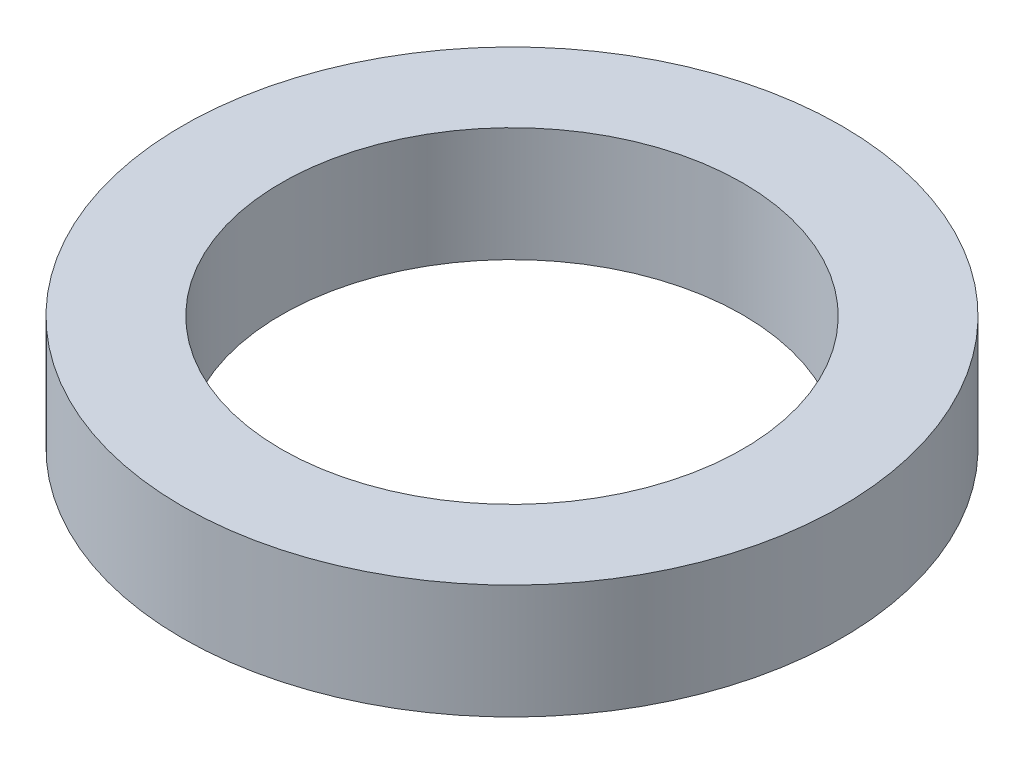
ISO-10303-21;
HEADER;
FILE_DESCRIPTION(('STEP AP214'),'2;1');
FILE_NAME('part.step','',(''),(''),'','','');
FILE_SCHEMA(('AUTOMOTIVE_DESIGN { 1 0 10303 214 1 1 1 1 }'));
ENDSEC;
DATA;
#1=APPLICATION_CONTEXT('core data for automotive mechanical design processes');
#2=APPLICATION_PROTOCOL_DEFINITION('international standard','automotive_design',2000,#1);
#3=PRODUCT_CONTEXT('',#1,'mechanical');
#4=PRODUCT('Part','Part','',(#3));
#5=PRODUCT_RELATED_PRODUCT_CATEGORY('part','',(#4));
#6=PRODUCT_DEFINITION_FORMATION('','',#4);
#7=PRODUCT_DEFINITION_CONTEXT('part definition',#1,'design');
#8=PRODUCT_DEFINITION('design','',#6,#7);
#9=PRODUCT_DEFINITION_SHAPE('','',#8);
#10=(LENGTH_UNIT() NAMED_UNIT(*) SI_UNIT(.MILLI.,.METRE.));
#11=(NAMED_UNIT(*) PLANE_ANGLE_UNIT() SI_UNIT($,.RADIAN.));
#12=(NAMED_UNIT(*) SI_UNIT($,.STERADIAN.) SOLID_ANGLE_UNIT());
#13=UNCERTAINTY_MEASURE_WITH_UNIT(LENGTH_MEASURE(1.E-05),#10,'distance_accuracy_value','');
#14=(GEOMETRIC_REPRESENTATION_CONTEXT(3) GLOBAL_UNCERTAINTY_ASSIGNED_CONTEXT((#13)) GLOBAL_UNIT_ASSIGNED_CONTEXT((#10,
#11,#12)) REPRESENTATION_CONTEXT('',''));
#15=CARTESIAN_POINT('',(0.,0.,0.));
#16=DIRECTION('',(0.,0.,1.));
#17=DIRECTION('',(1.,0.,0.));
#18=AXIS2_PLACEMENT_3D('',#15,#16,#17);
#19=CARTESIAN_POINT('',(0.,1.3208,0.));
#20=DIRECTION('',(0.,1.,0.));
#21=DIRECTION('',(0.,0.,1.));
#22=AXIS2_PLACEMENT_3D('',#19,#20,#21);
#23=PLANE('',#22);
#24=CARTESIAN_POINT('',(0.,1.3208,0.));
#25=DIRECTION('',(0.,1.,0.));
#26=DIRECTION('',(0.,0.,1.));
#27=AXIS2_PLACEMENT_3D('',#24,#25,#26);
#28=CIRCLE('',#27,3.81);
#29=CARTESIAN_POINT('',(0.,1.3208,3.81));
#30=VERTEX_POINT('',#29);
#31=EDGE_CURVE('E10',#30,#30,#28,.T.);
#32=ORIENTED_EDGE('',*,*,#31,.T.);
#33=EDGE_LOOP('',(#32));
#34=FACE_BOUND('',#33,.T.);
#35=CARTESIAN_POINT('',(0.,1.3208,0.));
#36=DIRECTION('',(0.,1.,0.));
#37=DIRECTION('',(0.,0.,1.));
#38=AXIS2_PLACEMENT_3D('',#35,#36,#37);
#39=CIRCLE('',#38,2.667);
#40=CARTESIAN_POINT('',(0.,1.3208,2.667));
#41=VERTEX_POINT('',#40);
#42=EDGE_CURVE('E43',#41,#41,#39,.T.);
#43=ORIENTED_EDGE('',*,*,#42,.F.);
#44=EDGE_LOOP('',(#43));
#45=FACE_BOUND('',#44,.T.);
#46=ADVANCED_FACE('F32',(#34,#45),#23,.T.);
#47=CARTESIAN_POINT('',(0.,0.,0.));
#48=DIRECTION('',(0.,1.,0.));
#49=DIRECTION('',(0.,0.,1.));
#50=AXIS2_PLACEMENT_3D('',#47,#48,#49);
#51=PLANE('',#50);
#52=CARTESIAN_POINT('',(0.,0.,0.));
#53=DIRECTION('',(0.,1.,0.));
#54=DIRECTION('',(0.,0.,1.));
#55=AXIS2_PLACEMENT_3D('',#52,#53,#54);
#56=CIRCLE('',#55,3.81);
#57=CARTESIAN_POINT('',(0.,0.,3.81));
#58=VERTEX_POINT('',#57);
#59=EDGE_CURVE('E36',#58,#58,#56,.T.);
#60=ORIENTED_EDGE('',*,*,#59,.F.);
#61=EDGE_LOOP('',(#60));
#62=FACE_BOUND('',#61,.T.);
#63=CARTESIAN_POINT('',(0.,0.,0.));
#64=DIRECTION('',(0.,1.,0.));
#65=DIRECTION('',(0.,0.,1.));
#66=AXIS2_PLACEMENT_3D('',#63,#64,#65);
#67=CIRCLE('',#66,2.667);
#68=CARTESIAN_POINT('',(0.,0.,2.667));
#69=VERTEX_POINT('',#68);
#70=EDGE_CURVE('E45',#69,#69,#67,.T.);
#71=ORIENTED_EDGE('',*,*,#70,.T.);
#72=EDGE_LOOP('',(#71));
#73=FACE_BOUND('',#72,.T.);
#74=ADVANCED_FACE('F55',(#62,#73),#51,.F.);
#75=CARTESIAN_POINT('',(0.,1.3208,0.));
#76=DIRECTION('',(0.,-1.,0.));
#77=DIRECTION('',(0.,0.,-1.));
#78=AXIS2_PLACEMENT_3D('',#75,#76,#77);
#79=CYLINDRICAL_SURFACE('',#78,3.81);
#80=ORIENTED_EDGE('',*,*,#31,.F.);
#81=EDGE_LOOP('',(#80));
#82=FACE_BOUND('',#81,.T.);
#83=ORIENTED_EDGE('',*,*,#59,.T.);
#84=EDGE_LOOP('',(#83));
#85=FACE_BOUND('',#84,.T.);
#86=ADVANCED_FACE('F34',(#82,#85),#79,.T.);
#87=CARTESIAN_POINT('',(0.,1.3208,0.));
#88=DIRECTION('',(0.,-1.,0.));
#89=DIRECTION('',(0.,0.,-1.));
#90=AXIS2_PLACEMENT_3D('',#87,#88,#89);
#91=CYLINDRICAL_SURFACE('',#90,2.667);
#92=ORIENTED_EDGE('',*,*,#42,.T.);
#93=EDGE_LOOP('',(#92));
#94=FACE_BOUND('',#93,.T.);
#95=ORIENTED_EDGE('',*,*,#70,.F.);
#96=EDGE_LOOP('',(#95));
#97=FACE_BOUND('',#96,.T.);
#98=ADVANCED_FACE('F51',(#94,#97),#91,.F.);
#99=CLOSED_SHELL('',(#46,#74,#86,#98));
#100=MANIFOLD_SOLID_BREP('B2',#99);
#101=ADVANCED_BREP_SHAPE_REPRESENTATION('',(#18,#100),#14);
#102=SHAPE_DEFINITION_REPRESENTATION(#9,#101);
ENDSEC;
END-ISO-10303-21;
